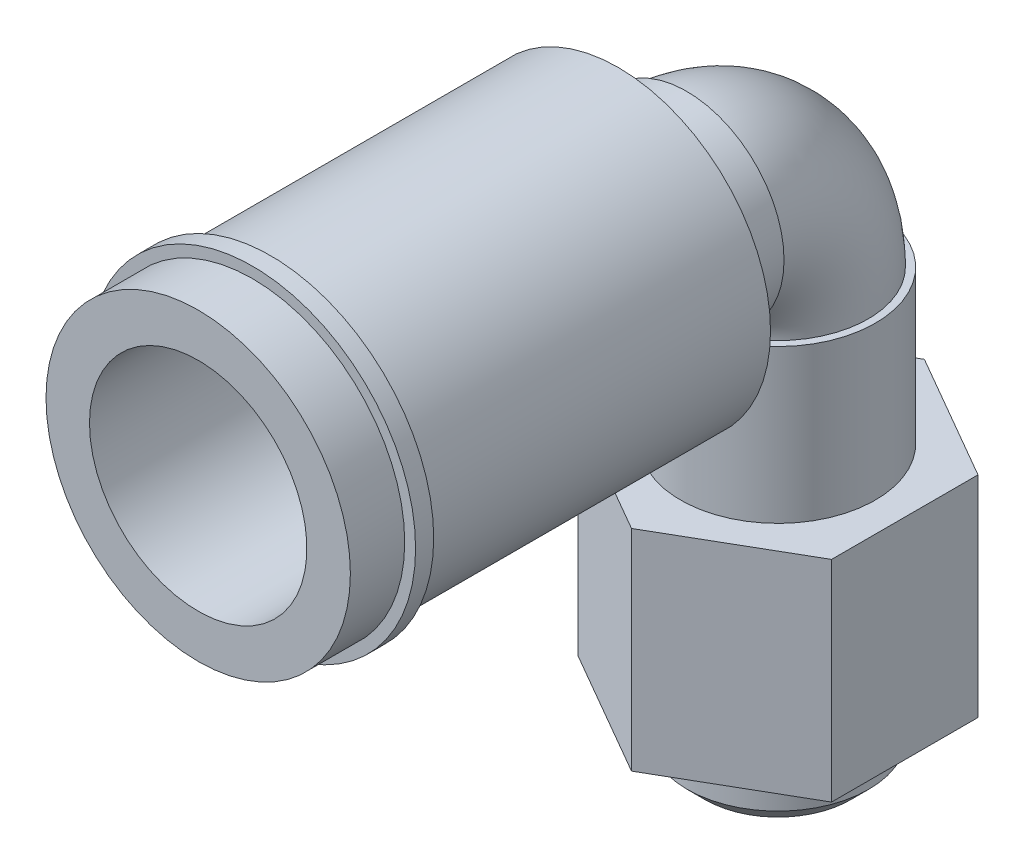
ISO-10303-21;
HEADER;
FILE_DESCRIPTION(('STEP AP214'),'2;1');
FILE_NAME('part.step','',(''),(''),'','','');
FILE_SCHEMA(('AUTOMOTIVE_DESIGN { 1 0 10303 214 1 1 1 1 }'));
ENDSEC;
DATA;
#1=APPLICATION_CONTEXT('core data for automotive mechanical design processes');
#2=APPLICATION_PROTOCOL_DEFINITION('international standard','automotive_design',2000,#1);
#3=PRODUCT_CONTEXT('',#1,'mechanical');
#4=PRODUCT('Part','Part','',(#3));
#5=PRODUCT_RELATED_PRODUCT_CATEGORY('part','',(#4));
#6=PRODUCT_DEFINITION_FORMATION('','',#4);
#7=PRODUCT_DEFINITION_CONTEXT('part definition',#1,'design');
#8=PRODUCT_DEFINITION('design','',#6,#7);
#9=PRODUCT_DEFINITION_SHAPE('','',#8);
#10=(LENGTH_UNIT() NAMED_UNIT(*) SI_UNIT(.MILLI.,.METRE.));
#11=(NAMED_UNIT(*) PLANE_ANGLE_UNIT() SI_UNIT($,.RADIAN.));
#12=(NAMED_UNIT(*) SI_UNIT($,.STERADIAN.) SOLID_ANGLE_UNIT());
#13=UNCERTAINTY_MEASURE_WITH_UNIT(LENGTH_MEASURE(1.E-05),#10,'distance_accuracy_value','');
#14=(GEOMETRIC_REPRESENTATION_CONTEXT(3) GLOBAL_UNCERTAINTY_ASSIGNED_CONTEXT((#13)) GLOBAL_UNIT_ASSIGNED_CONTEXT((#10,
#11,#12)) REPRESENTATION_CONTEXT('',''));
#15=CARTESIAN_POINT('',(0.,0.,0.));
#16=DIRECTION('',(0.,0.,1.));
#17=DIRECTION('',(1.,0.,0.));
#18=AXIS2_PLACEMENT_3D('',#15,#16,#17);
#19=CARTESIAN_POINT('',(-3.,11.4639957962037,5.));
#20=DIRECTION('',(0.,0.,1.));
#21=DIRECTION('',(1.,0.,0.));
#22=AXIS2_PLACEMENT_3D('',#19,#20,#21);
#23=PLANE('',#22);
#24=CARTESIAN_POINT('',(0.,14.5,5.));
#25=DIRECTION('',(0.,0.,-1.));
#26=DIRECTION('',(-1.,0.,0.));
#27=AXIS2_PLACEMENT_3D('',#24,#25,#26);
#28=CIRCLE('',#27,3.);
#29=CARTESIAN_POINT('',(-3.,14.5,5.));
#30=VERTEX_POINT('',#29);
#31=EDGE_CURVE('E19',#30,#30,#28,.T.);
#32=ORIENTED_EDGE('',*,*,#31,.F.);
#33=EDGE_LOOP('',(#32));
#34=FACE_BOUND('',#33,.T.);
#35=ADVANCED_FACE('F16',(#34),#23,.T.);
#36=CARTESIAN_POINT('',(0.,14.5,16.));
#37=DIRECTION('',(0.,0.,-1.));
#38=DIRECTION('',(-1.,0.,0.));
#39=AXIS2_PLACEMENT_3D('',#36,#37,#38);
#40=CYLINDRICAL_SURFACE('',#39,3.);
#41=ORIENTED_EDGE('',*,*,#31,.T.);
#42=EDGE_LOOP('',(#41));
#43=FACE_BOUND('',#42,.T.);
#44=CARTESIAN_POINT('',(0.,14.5,16.));
#45=DIRECTION('',(0.,0.,-1.));
#46=DIRECTION('',(-1.,0.,0.));
#47=AXIS2_PLACEMENT_3D('',#44,#45,#46);
#48=CIRCLE('',#47,3.);
#49=CARTESIAN_POINT('',(-3.,14.5,16.));
#50=VERTEX_POINT('',#49);
#51=EDGE_CURVE('E270',#50,#50,#48,.T.);
#52=ORIENTED_EDGE('',*,*,#51,.F.);
#53=EDGE_LOOP('',(#52));
#54=FACE_BOUND('',#53,.T.);
#55=ADVANCED_FACE('F257',(#43,#54),#40,.F.);
#56=CARTESIAN_POINT('',(4.2,18.7504021082164,16.));
#57=DIRECTION('',(0.,0.,1.));
#58=DIRECTION('',(-1.,0.,0.));
#59=AXIS2_PLACEMENT_3D('',#56,#57,#58);
#60=PLANE('',#59);
#61=ORIENTED_EDGE('',*,*,#51,.T.);
#62=EDGE_LOOP('',(#61));
#63=FACE_BOUND('',#62,.T.);
#64=CARTESIAN_POINT('',(0.,14.5,16.));
#65=DIRECTION('',(0.,0.,1.));
#66=DIRECTION('',(1.,0.,0.));
#67=AXIS2_PLACEMENT_3D('',#64,#65,#66);
#68=CIRCLE('',#67,4.2);
#69=CARTESIAN_POINT('',(4.2,14.5,16.));
#70=VERTEX_POINT('',#69);
#71=EDGE_CURVE('E271',#70,#70,#68,.F.);
#72=ORIENTED_EDGE('',*,*,#71,.F.);
#73=EDGE_LOOP('',(#72));
#74=FACE_BOUND('',#73,.T.);
#75=ADVANCED_FACE('F254',(#63,#74),#60,.T.);
#76=CARTESIAN_POINT('',(0.,14.5,16.));
#77=DIRECTION('',(0.,0.,1.));
#78=DIRECTION('',(1.,0.,0.));
#79=AXIS2_PLACEMENT_3D('',#76,#77,#78);
#80=CYLINDRICAL_SURFACE('',#79,4.2);
#81=ORIENTED_EDGE('',*,*,#71,.T.);
#82=EDGE_LOOP('',(#81));
#83=FACE_BOUND('',#82,.T.);
#84=CARTESIAN_POINT('',(0.,14.5,14.5));
#85=DIRECTION('',(0.,0.,1.));
#86=DIRECTION('',(1.,0.,0.));
#87=AXIS2_PLACEMENT_3D('',#84,#85,#86);
#88=CIRCLE('',#87,4.2);
#89=CARTESIAN_POINT('',(4.2,14.5,14.5));
#90=VERTEX_POINT('',#89);
#91=EDGE_CURVE('E273',#90,#90,#88,.F.);
#92=ORIENTED_EDGE('',*,*,#91,.F.);
#93=EDGE_LOOP('',(#92));
#94=FACE_BOUND('',#93,.T.);
#95=ADVANCED_FACE('F250',(#83,#94),#80,.T.);
#96=CARTESIAN_POINT('',(2.01,0.,2.03412212055392));
#97=DIRECTION('',(0.,-1.,0.));
#98=DIRECTION('',(-1.,0.,0.));
#99=AXIS2_PLACEMENT_3D('',#96,#97,#98);
#100=PLANE('',#99);
#101=CARTESIAN_POINT('',(0.,0.,0.));
#102=DIRECTION('',(0.,1.,0.));
#103=DIRECTION('',(0.,0.,1.));
#104=AXIS2_PLACEMENT_3D('',#101,#102,#103);
#105=CIRCLE('',#104,2.01);
#106=CARTESIAN_POINT('',(0.,0.,2.01));
#107=VERTEX_POINT('',#106);
#108=EDGE_CURVE('E278',#107,#107,#105,.T.);
#109=ORIENTED_EDGE('',*,*,#108,.F.);
#110=EDGE_LOOP('',(#109));
#111=FACE_BOUND('',#110,.T.);
#112=ADVANCED_FACE('F246',(#111),#100,.T.);
#113=CARTESIAN_POINT('',(4.5,19.0540021082242,14.5));
#114=DIRECTION('',(0.,0.,1.));
#115=DIRECTION('',(-1.,0.,0.));
#116=AXIS2_PLACEMENT_3D('',#113,#114,#115);
#117=PLANE('',#116);
#118=ORIENTED_EDGE('',*,*,#91,.T.);
#119=EDGE_LOOP('',(#118));
#120=FACE_BOUND('',#119,.T.);
#121=CARTESIAN_POINT('',(0.,14.5,14.5));
#122=DIRECTION('',(0.,0.,1.));
#123=DIRECTION('',(1.,0.,0.));
#124=AXIS2_PLACEMENT_3D('',#121,#122,#123);
#125=CIRCLE('',#124,4.5);
#126=CARTESIAN_POINT('',(4.5,14.5,14.5));
#127=VERTEX_POINT('',#126);
#128=EDGE_CURVE('E102',#127,#127,#125,.F.);
#129=ORIENTED_EDGE('',*,*,#128,.F.);
#130=EDGE_LOOP('',(#129));
#131=FACE_BOUND('',#130,.T.);
#132=ADVANCED_FACE('F242',(#120,#131),#117,.T.);
#133=CARTESIAN_POINT('',(0.,0.,0.));
#134=DIRECTION('',(0.,1.,0.));
#135=DIRECTION('',(0.,0.,1.));
#136=AXIS2_PLACEMENT_3D('',#133,#134,#135);
#137=CONICAL_SURFACE('',#136,2.01,0.785398163397449);
#138=CARTESIAN_POINT('',(0.,0.49,0.));
#139=DIRECTION('',(0.,-1.,0.));
#140=DIRECTION('',(-1.,0.,0.));
#141=AXIS2_PLACEMENT_3D('',#138,#139,#140);
#142=CIRCLE('',#141,2.5);
#143=CARTESIAN_POINT('',(-2.5,0.49,0.));
#144=VERTEX_POINT('',#143);
#145=EDGE_CURVE('E99',#144,#144,#142,.F.);
#146=ORIENTED_EDGE('',*,*,#145,.F.);
#147=EDGE_LOOP('',(#146));
#148=FACE_BOUND('',#147,.T.);
#149=ORIENTED_EDGE('',*,*,#108,.T.);
#150=EDGE_LOOP('',(#149));
#151=FACE_BOUND('',#150,.T.);
#152=ADVANCED_FACE('F238',(#148,#151),#137,.T.);
#153=CARTESIAN_POINT('',(0.,14.5,14.5));
#154=DIRECTION('',(0.,0.,1.));
#155=DIRECTION('',(1.,0.,0.));
#156=AXIS2_PLACEMENT_3D('',#153,#154,#155);
#157=CYLINDRICAL_SURFACE('',#156,4.5);
#158=ORIENTED_EDGE('',*,*,#128,.T.);
#159=EDGE_LOOP('',(#158));
#160=FACE_BOUND('',#159,.T.);
#161=CARTESIAN_POINT('',(0.,14.5,14.));
#162=DIRECTION('',(0.,0.,1.));
#163=DIRECTION('',(1.,0.,0.));
#164=AXIS2_PLACEMENT_3D('',#161,#162,#163);
#165=CIRCLE('',#164,4.5);
#166=CARTESIAN_POINT('',(4.5,14.5,14.));
#167=VERTEX_POINT('',#166);
#168=EDGE_CURVE('E101',#167,#167,#165,.F.);
#169=ORIENTED_EDGE('',*,*,#168,.F.);
#170=EDGE_LOOP('',(#169));
#171=FACE_BOUND('',#170,.T.);
#172=ADVANCED_FACE('F234',(#160,#171),#157,.T.);
#173=CARTESIAN_POINT('',(0.,0.49,0.));
#174=DIRECTION('',(0.,-1.,0.));
#175=DIRECTION('',(0.,0.,-1.));
#176=AXIS2_PLACEMENT_3D('',#173,#174,#175);
#177=CYLINDRICAL_SURFACE('',#176,2.5);
#178=CARTESIAN_POINT('',(0.,1.7,0.));
#179=DIRECTION('',(0.,-1.,0.));
#180=DIRECTION('',(0.,0.,-1.));
#181=AXIS2_PLACEMENT_3D('',#178,#179,#180);
#182=CIRCLE('',#181,2.5);
#183=CARTESIAN_POINT('',(0.,1.7,-2.5));
#184=VERTEX_POINT('',#183);
#185=EDGE_CURVE('E285',#184,#184,#182,.F.);
#186=ORIENTED_EDGE('',*,*,#185,.F.);
#187=EDGE_LOOP('',(#186));
#188=FACE_BOUND('',#187,.T.);
#189=ORIENTED_EDGE('',*,*,#145,.T.);
#190=EDGE_LOOP('',(#189));
#191=FACE_BOUND('',#190,.T.);
#192=ADVANCED_FACE('F230',(#188,#191),#177,.T.);
#193=CARTESIAN_POINT('',(-4.5,19.0540021082242,14.));
#194=DIRECTION('',(0.,0.,-1.));
#195=DIRECTION('',(1.,0.,0.));
#196=AXIS2_PLACEMENT_3D('',#193,#194,#195);
#197=PLANE('',#196);
#198=CARTESIAN_POINT('',(0.,14.5,14.));
#199=DIRECTION('',(0.,0.,1.));
#200=DIRECTION('',(0.,-1.,0.));
#201=AXIS2_PLACEMENT_3D('',#198,#199,#200);
#202=CIRCLE('',#201,4.20000000000001);
#203=CARTESIAN_POINT('',(0.,10.3,14.));
#204=VERTEX_POINT('',#203);
#205=EDGE_CURVE('E80',#204,#204,#202,.F.);
#206=ORIENTED_EDGE('',*,*,#205,.F.);
#207=EDGE_LOOP('',(#206));
#208=FACE_BOUND('',#207,.T.);
#209=ORIENTED_EDGE('',*,*,#168,.T.);
#210=EDGE_LOOP('',(#209));
#211=FACE_BOUND('',#210,.T.);
#212=ADVANCED_FACE('F226',(#208,#211),#197,.T.);
#213=CARTESIAN_POINT('',(-3.5,1.7,4.04145188432738));
#214=DIRECTION('',(0.,-1.,0.));
#215=DIRECTION('',(0.,0.,-1.));
#216=AXIS2_PLACEMENT_3D('',#213,#214,#215);
#217=PLANE('',#216);
#218=ORIENTED_EDGE('',*,*,#185,.T.);
#219=EDGE_LOOP('',(#218));
#220=FACE_BOUND('',#219,.T.);
#221=DIRECTION('',(0.866025403784439,0.,-0.5));
#222=VECTOR('',#221,1.);
#223=CARTESIAN_POINT('',(1.75,1.7,3.03108891324554));
#224=LINE('',#223,#222);
#225=CARTESIAN_POINT('',(6.25061246793852E-08,1.7,4.04145184823945));
#226=VERTEX_POINT('',#225);
#227=CARTESIAN_POINT('',(3.5,1.7,2.02072594216369));
#228=VERTEX_POINT('',#227);
#229=EDGE_CURVE('E185',#226,#228,#224,.T.);
#230=ORIENTED_EDGE('',*,*,#229,.F.);
#231=DIRECTION('',(0.866025403784439,0.,0.5));
#232=VECTOR('',#231,1.);
#233=CARTESIAN_POINT('',(-1.75,1.7,3.03108891324554));
#234=LINE('',#233,#232);
#235=CARTESIAN_POINT('',(-3.5,1.7,2.02072594216369));
#236=VERTEX_POINT('',#235);
#237=EDGE_CURVE('E84',#236,#226,#234,.T.);
#238=ORIENTED_EDGE('',*,*,#237,.F.);
#239=DIRECTION('',(0.,0.,1.));
#240=VECTOR('',#239,1.);
#241=CARTESIAN_POINT('',(-3.5,1.7,0.));
#242=LINE('',#241,#240);
#243=CARTESIAN_POINT('',(-3.5,1.7,-2.02072594216369));
#244=VERTEX_POINT('',#243);
#245=EDGE_CURVE('E66',#244,#236,#242,.T.);
#246=ORIENTED_EDGE('',*,*,#245,.F.);
#247=DIRECTION('',(-0.866025403784439,0.,0.5));
#248=VECTOR('',#247,1.);
#249=CARTESIAN_POINT('',(-1.75,1.7,-3.03108891324554));
#250=LINE('',#249,#248);
#251=CARTESIAN_POINT('',(-1.2501224919614E-07,1.7,-4.04145181215153));
#252=VERTEX_POINT('',#251);
#253=EDGE_CURVE('E71',#252,#244,#250,.T.);
#254=ORIENTED_EDGE('',*,*,#253,.F.);
#255=DIRECTION('',(-0.866025403784439,0.,-0.5));
#256=VECTOR('',#255,1.);
#257=CARTESIAN_POINT('',(1.75,1.7,-3.03108891324554));
#258=LINE('',#257,#256);
#259=CARTESIAN_POINT('',(3.5,1.7,-2.02072594216369));
#260=VERTEX_POINT('',#259);
#261=EDGE_CURVE('E177',#260,#252,#258,.T.);
#262=ORIENTED_EDGE('',*,*,#261,.F.);
#263=DIRECTION('',(0.,0.,-1.));
#264=VECTOR('',#263,1.);
#265=CARTESIAN_POINT('',(3.5,1.7,0.));
#266=LINE('',#265,#264);
#267=EDGE_CURVE('E180',#228,#260,#266,.T.);
#268=ORIENTED_EDGE('',*,*,#267,.F.);
#269=EDGE_LOOP('',(#230,#238,#246,#254,#262,#268));
#270=FACE_BOUND('',#269,.T.);
#271=ADVANCED_FACE('F83',(#220,#270),#217,.T.);
#272=CARTESIAN_POINT('',(0.,14.5,14.));
#273=DIRECTION('',(0.,0.,1.));
#274=DIRECTION('',(0.,-1.,0.));
#275=AXIS2_PLACEMENT_3D('',#272,#273,#274);
#276=CYLINDRICAL_SURFACE('',#275,4.20000000000001);
#277=ORIENTED_EDGE('',*,*,#205,.T.);
#278=EDGE_LOOP('',(#277));
#279=FACE_BOUND('',#278,.T.);
#280=CARTESIAN_POINT('',(0.,14.5,4.40513917895586));
#281=DIRECTION('',(0.,0.,-1.));
#282=DIRECTION('',(-1.,0.,0.));
#283=AXIS2_PLACEMENT_3D('',#280,#281,#282);
#284=CIRCLE('',#283,4.20000000000001);
#285=CARTESIAN_POINT('',(-4.20000000000001,14.5,4.40513917895586));
#286=VERTEX_POINT('',#285);
#287=EDGE_CURVE('E95',#286,#286,#284,.T.);
#288=ORIENTED_EDGE('',*,*,#287,.F.);
#289=EDGE_LOOP('',(#288));
#290=FACE_BOUND('',#289,.T.);
#291=ADVANCED_FACE('F220',(#279,#290),#276,.T.);
#292=CARTESIAN_POINT('',(0.,1.7,-4.04145188432738));
#293=DIRECTION('',(-0.5,0.,-0.866025403784438));
#294=DIRECTION('',(-0.866025403784438,0.,0.5));
#295=AXIS2_PLACEMENT_3D('',#292,#293,#294);
#296=PLANE('',#295);
#297=ORIENTED_EDGE('',*,*,#253,.T.);
#298=DIRECTION('',(0.,1.,0.));
#299=VECTOR('',#298,1.);
#300=CARTESIAN_POINT('',(-3.5,1.7,-2.02072594216369));
#301=LINE('',#300,#299);
#302=CARTESIAN_POINT('',(-3.5,7.5,-2.02072594216369));
#303=VERTEX_POINT('',#302);
#304=EDGE_CURVE('E73',#303,#244,#301,.F.);
#305=ORIENTED_EDGE('',*,*,#304,.F.);
#306=CARTESIAN_POINT('',(0.,7.5,-4.04145188432738));
#307=CARTESIAN_POINT('',(-0.145833333333333,7.5,-3.95725497007056));
#308=CARTESIAN_POINT('',(-0.291666666666667,7.5,-3.87305805581374));
#309=CARTESIAN_POINT('',(-0.583333333333333,7.5,-3.7046642273001));
#310=CARTESIAN_POINT('',(-0.729166666666667,7.5,-3.62046731304328));
#311=CARTESIAN_POINT('',(-1.02083333333333,7.5,-3.45207348452964));
#312=CARTESIAN_POINT('',(-1.16666666666667,7.5,-3.36787657027282));
#313=CARTESIAN_POINT('',(-1.45833333333333,7.5,-3.19948274175918));
#314=CARTESIAN_POINT('',(-1.60416666666667,7.5,-3.11528582750236));
#315=CARTESIAN_POINT('',(-1.89583333333333,7.5,-2.94689199898872));
#316=CARTESIAN_POINT('',(-2.04166666666667,7.5,-2.86269508473189));
#317=CARTESIAN_POINT('',(-2.33333333333333,7.5,-2.69430125621825));
#318=CARTESIAN_POINT('',(-2.47916666666667,7.5,-2.61010434196143));
#319=CARTESIAN_POINT('',(-2.77083333333333,7.5,-2.44171051344779));
#320=CARTESIAN_POINT('',(-2.91666666666667,7.5,-2.35751359919097));
#321=CARTESIAN_POINT('',(-3.20833333333333,7.5,-2.18911977067733));
#322=CARTESIAN_POINT('',(-3.35416666666667,7.5,-2.10492285642051));
#323=CARTESIAN_POINT('',(-3.5,7.5,-2.02072594216369));
#324=B_SPLINE_CURVE_WITH_KNOTS('',3,(#306,#307,#308,#309,#310,#311,#312,#313,#314,#315,#316,
#317,#318,#319,#320,#321,#322,#323),.UNSPECIFIED.,.F.,.F.,(4,2,2,2,2,2,2,2,4),(0.,
0.505181485540923,1.01036297108185,1.51554445662277,2.02072594216369,2.52590742770461,
3.03108891324554,3.53627039878646,4.04145188432738),.UNSPECIFIED.);
#325=CARTESIAN_POINT('',(-6.25061247335953E-08,7.5,-4.04145184823945));
#326=VERTEX_POINT('',#325);
#327=EDGE_CURVE('E98',#326,#303,#324,.T.);
#328=ORIENTED_EDGE('',*,*,#327,.F.);
#329=DIRECTION('',(0.,1.,0.));
#330=VECTOR('',#329,1.);
#331=CARTESIAN_POINT('',(0.,1.7,-4.04145188432738));
#332=LINE('',#331,#330);
#333=EDGE_CURVE('E76',#252,#326,#332,.T.);
#334=ORIENTED_EDGE('',*,*,#333,.F.);
#335=EDGE_LOOP('',(#297,#305,#328,#334));
#336=FACE_BOUND('',#335,.T.);
#337=ADVANCED_FACE('F72',(#336),#296,.T.);
#338=CARTESIAN_POINT('',(-3.5,1.7,-2.02072594216369));
#339=DIRECTION('',(-1.,0.,0.));
#340=DIRECTION('',(0.,0.,1.));
#341=AXIS2_PLACEMENT_3D('',#338,#339,#340);
#342=PLANE('',#341);
#343=ORIENTED_EDGE('',*,*,#245,.T.);
#344=DIRECTION('',(0.,1.,0.));
#345=VECTOR('',#344,1.);
#346=CARTESIAN_POINT('',(-3.5,1.7,2.02072594216369));
#347=LINE('',#346,#345);
#348=CARTESIAN_POINT('',(-3.5,7.5,2.02072594216369));
#349=VERTEX_POINT('',#348);
#350=EDGE_CURVE('E86',#349,#236,#347,.F.);
#351=ORIENTED_EDGE('',*,*,#350,.F.);
#352=DIRECTION('',(0.,0.,1.));
#353=VECTOR('',#352,1.);
#354=CARTESIAN_POINT('',(-3.5,7.5,0.));
#355=LINE('',#354,#353);
#356=EDGE_CURVE('E90',#303,#349,#355,.T.);
#357=ORIENTED_EDGE('',*,*,#356,.F.);
#358=ORIENTED_EDGE('',*,*,#304,.T.);
#359=EDGE_LOOP('',(#343,#351,#357,#358));
#360=FACE_BOUND('',#359,.T.);
#361=ADVANCED_FACE('F88',(#360),#342,.T.);
#362=CARTESIAN_POINT('',(-3.5,1.7,2.02072594216369));
#363=DIRECTION('',(-0.5,0.,0.866025403784438));
#364=DIRECTION('',(0.866025403784438,0.,0.5));
#365=AXIS2_PLACEMENT_3D('',#362,#363,#364);
#366=PLANE('',#365);
#367=ORIENTED_EDGE('',*,*,#237,.T.);
#368=DIRECTION('',(0.,1.,0.));
#369=VECTOR('',#368,1.);
#370=CARTESIAN_POINT('',(0.,1.7,4.04145188432738));
#371=LINE('',#370,#369);
#372=CARTESIAN_POINT('',(-6.25061246251751E-08,7.5,4.04145184823945));
#373=VERTEX_POINT('',#372);
#374=EDGE_CURVE('E187',#373,#226,#371,.F.);
#375=ORIENTED_EDGE('',*,*,#374,.F.);
#376=CARTESIAN_POINT('',(-3.5,7.5,2.02072594216369));
#377=CARTESIAN_POINT('',(-3.35416666666667,7.5,2.10492285642051));
#378=CARTESIAN_POINT('',(-3.20833333333333,7.5,2.18911977067733));
#379=CARTESIAN_POINT('',(-2.91666666666667,7.5,2.35751359919097));
#380=CARTESIAN_POINT('',(-2.77083333333333,7.5,2.44171051344779));
#381=CARTESIAN_POINT('',(-2.47916666666667,7.5,2.61010434196143));
#382=CARTESIAN_POINT('',(-2.33333333333333,7.5,2.69430125621825));
#383=CARTESIAN_POINT('',(-2.04166666666667,7.5,2.86269508473189));
#384=CARTESIAN_POINT('',(-1.89583333333333,7.5,2.94689199898872));
#385=CARTESIAN_POINT('',(-1.60416666666667,7.5,3.11528582750236));
#386=CARTESIAN_POINT('',(-1.45833333333333,7.5,3.19948274175918));
#387=CARTESIAN_POINT('',(-1.16666666666667,7.5,3.36787657027282));
#388=CARTESIAN_POINT('',(-1.02083333333333,7.5,3.45207348452964));
#389=CARTESIAN_POINT('',(-0.729166666666667,7.5,3.62046731304328));
#390=CARTESIAN_POINT('',(-0.583333333333333,7.5,3.7046642273001));
#391=CARTESIAN_POINT('',(-0.291666666666667,7.5,3.87305805581374));
#392=CARTESIAN_POINT('',(-0.145833333333333,7.5,3.95725497007056));
#393=CARTESIAN_POINT('',(0.,7.5,4.04145188432738));
#394=B_SPLINE_CURVE_WITH_KNOTS('',3,(#376,#377,#378,#379,#380,#381,#382,#383,#384,#385,#386,
#387,#388,#389,#390,#391,#392,#393),.UNSPECIFIED.,.F.,.F.,(4,2,2,2,2,2,2,2,4),(0.,
0.505181485540922,1.01036297108184,1.51554445662277,2.02072594216369,2.52590742770461,
3.03108891324554,3.53627039878646,4.04145188432738),.UNSPECIFIED.);
#395=EDGE_CURVE('E155',#349,#373,#394,.T.);
#396=ORIENTED_EDGE('',*,*,#395,.F.);
#397=ORIENTED_EDGE('',*,*,#350,.T.);
#398=EDGE_LOOP('',(#367,#375,#396,#397));
#399=FACE_BOUND('',#398,.T.);
#400=ADVANCED_FACE('F191',(#399),#366,.T.);
#401=CARTESIAN_POINT('',(0.,1.7,4.04145188432738));
#402=DIRECTION('',(0.5,0.,0.866025403784438));
#403=DIRECTION('',(0.866025403784438,0.,-0.5));
#404=AXIS2_PLACEMENT_3D('',#401,#402,#403);
#405=PLANE('',#404);
#406=ORIENTED_EDGE('',*,*,#229,.T.);
#407=DIRECTION('',(0.,1.,0.));
#408=VECTOR('',#407,1.);
#409=CARTESIAN_POINT('',(3.5,1.7,2.02072594216369));
#410=LINE('',#409,#408);
#411=CARTESIAN_POINT('',(3.5,7.5,2.02072594216369));
#412=VERTEX_POINT('',#411);
#413=EDGE_CURVE('E182',#412,#228,#410,.F.);
#414=ORIENTED_EDGE('',*,*,#413,.F.);
#415=CARTESIAN_POINT('',(0.,7.5,4.04145188432738));
#416=CARTESIAN_POINT('',(0.145833333333333,7.5,3.95725497007056));
#417=CARTESIAN_POINT('',(0.291666666666667,7.5,3.87305805581374));
#418=CARTESIAN_POINT('',(0.583333333333333,7.5,3.7046642273001));
#419=CARTESIAN_POINT('',(0.729166666666667,7.5,3.62046731304328));
#420=CARTESIAN_POINT('',(1.02083333333333,7.5,3.45207348452964));
#421=CARTESIAN_POINT('',(1.16666666666667,7.5,3.36787657027282));
#422=CARTESIAN_POINT('',(1.45833333333333,7.5,3.19948274175918));
#423=CARTESIAN_POINT('',(1.60416666666667,7.5,3.11528582750236));
#424=CARTESIAN_POINT('',(1.89583333333333,7.5,2.94689199898872));
#425=CARTESIAN_POINT('',(2.04166666666667,7.5,2.86269508473189));
#426=CARTESIAN_POINT('',(2.33333333333333,7.5,2.69430125621825));
#427=CARTESIAN_POINT('',(2.47916666666667,7.5,2.61010434196143));
#428=CARTESIAN_POINT('',(2.77083333333333,7.5,2.44171051344779));
#429=CARTESIAN_POINT('',(2.91666666666667,7.5,2.35751359919097));
#430=CARTESIAN_POINT('',(3.20833333333333,7.5,2.18911977067733));
#431=CARTESIAN_POINT('',(3.35416666666667,7.5,2.10492285642051));
#432=CARTESIAN_POINT('',(3.5,7.5,2.02072594216369));
#433=B_SPLINE_CURVE_WITH_KNOTS('',3,(#415,#416,#417,#418,#419,#420,#421,#422,#423,#424,#425,
#426,#427,#428,#429,#430,#431,#432),.UNSPECIFIED.,.F.,.F.,(4,2,2,2,2,2,2,2,4),(0.,
0.505181485540923,1.01036297108185,1.51554445662277,2.02072594216369,2.52590742770461,
3.03108891324554,3.53627039878646,4.04145188432738),.UNSPECIFIED.);
#434=EDGE_CURVE('E151',#373,#412,#433,.T.);
#435=ORIENTED_EDGE('',*,*,#434,.F.);
#436=ORIENTED_EDGE('',*,*,#374,.T.);
#437=EDGE_LOOP('',(#406,#414,#435,#436));
#438=FACE_BOUND('',#437,.T.);
#439=ADVANCED_FACE('F194',(#438),#405,.T.);
#440=CARTESIAN_POINT('',(3.5,1.7,2.02072594216369));
#441=DIRECTION('',(1.,0.,0.));
#442=DIRECTION('',(0.,0.,-1.));
#443=AXIS2_PLACEMENT_3D('',#440,#441,#442);
#444=PLANE('',#443);
#445=ORIENTED_EDGE('',*,*,#267,.T.);
#446=DIRECTION('',(0.,1.,0.));
#447=VECTOR('',#446,1.);
#448=CARTESIAN_POINT('',(3.5,1.7,-2.02072594216369));
#449=LINE('',#448,#447);
#450=CARTESIAN_POINT('',(3.5,7.5,-2.02072594216369));
#451=VERTEX_POINT('',#450);
#452=EDGE_CURVE('E34',#451,#260,#449,.F.);
#453=ORIENTED_EDGE('',*,*,#452,.F.);
#454=DIRECTION('',(0.,0.,-1.));
#455=VECTOR('',#454,1.);
#456=CARTESIAN_POINT('',(3.5,7.5,0.));
#457=LINE('',#456,#455);
#458=EDGE_CURVE('E154',#412,#451,#457,.T.);
#459=ORIENTED_EDGE('',*,*,#458,.F.);
#460=ORIENTED_EDGE('',*,*,#413,.T.);
#461=EDGE_LOOP('',(#445,#453,#459,#460));
#462=FACE_BOUND('',#461,.T.);
#463=ADVANCED_FACE('F197',(#462),#444,.T.);
#464=CARTESIAN_POINT('',(3.5,1.7,-2.02072594216369));
#465=DIRECTION('',(0.5,0.,-0.866025403784438));
#466=DIRECTION('',(-0.866025403784438,0.,-0.5));
#467=AXIS2_PLACEMENT_3D('',#464,#465,#466);
#468=PLANE('',#467);
#469=ORIENTED_EDGE('',*,*,#261,.T.);
#470=ORIENTED_EDGE('',*,*,#333,.T.);
#471=CARTESIAN_POINT('',(3.5,7.5,-2.02072594216369));
#472=CARTESIAN_POINT('',(3.35416666666667,7.5,-2.10492285642051));
#473=CARTESIAN_POINT('',(3.20833333333333,7.5,-2.18911977067733));
#474=CARTESIAN_POINT('',(2.91666666666667,7.5,-2.35751359919097));
#475=CARTESIAN_POINT('',(2.77083333333333,7.5,-2.44171051344779));
#476=CARTESIAN_POINT('',(2.47916666666667,7.5,-2.61010434196143));
#477=CARTESIAN_POINT('',(2.33333333333333,7.5,-2.69430125621825));
#478=CARTESIAN_POINT('',(2.04166666666667,7.5,-2.86269508473189));
#479=CARTESIAN_POINT('',(1.89583333333333,7.5,-2.94689199898872));
#480=CARTESIAN_POINT('',(1.60416666666667,7.5,-3.11528582750236));
#481=CARTESIAN_POINT('',(1.45833333333333,7.5,-3.19948274175918));
#482=CARTESIAN_POINT('',(1.16666666666667,7.5,-3.36787657027282));
#483=CARTESIAN_POINT('',(1.02083333333333,7.5,-3.45207348452964));
#484=CARTESIAN_POINT('',(0.729166666666667,7.5,-3.62046731304328));
#485=CARTESIAN_POINT('',(0.583333333333333,7.5,-3.7046642273001));
#486=CARTESIAN_POINT('',(0.291666666666667,7.5,-3.87305805581374));
#487=CARTESIAN_POINT('',(0.145833333333333,7.5,-3.95725497007056));
#488=CARTESIAN_POINT('',(0.,7.5,-4.04145188432738));
#489=B_SPLINE_CURVE_WITH_KNOTS('',3,(#471,#472,#473,#474,#475,#476,#477,#478,#479,#480,#481,
#482,#483,#484,#485,#486,#487,#488),.UNSPECIFIED.,.F.,.F.,(4,2,2,2,2,2,2,2,4),(0.,
0.505181485540922,1.01036297108184,1.51554445662277,2.02072594216369,2.52590742770461,
3.03108891324554,3.53627039878646,4.04145188432738),.UNSPECIFIED.);
#490=EDGE_CURVE('E147',#451,#326,#489,.T.);
#491=ORIENTED_EDGE('',*,*,#490,.F.);
#492=ORIENTED_EDGE('',*,*,#452,.T.);
#493=EDGE_LOOP('',(#469,#470,#491,#492));
#494=FACE_BOUND('',#493,.T.);
#495=ADVANCED_FACE('F200',(#494),#468,.T.);
#496=CARTESIAN_POINT('',(0.,14.5,4.));
#497=DIRECTION('',(0.,0.,1.));
#498=DIRECTION('',(1.,0.,0.));
#499=AXIS2_PLACEMENT_3D('',#496,#497,#498);
#500=CONICAL_SURFACE('',#499,2.688,1.30899693899575);
#501=ORIENTED_EDGE('',*,*,#287,.T.);
#502=EDGE_LOOP('',(#501));
#503=FACE_BOUND('',#502,.T.);
#504=CARTESIAN_POINT('',(0.,14.5,4.));
#505=DIRECTION('',(0.,0.,1.));
#506=DIRECTION('',(-1.,0.,0.));
#507=AXIS2_PLACEMENT_3D('',#504,#505,#506);
#508=CIRCLE('',#507,2.688);
#509=CARTESIAN_POINT('',(-2.688,14.5,4.));
#510=VERTEX_POINT('',#509);
#511=EDGE_CURVE('E172',#510,#510,#508,.F.);
#512=ORIENTED_EDGE('',*,*,#511,.F.);
#513=EDGE_LOOP('',(#512));
#514=FACE_BOUND('',#513,.T.);
#515=ADVANCED_FACE('F202',(#503,#514),#500,.T.);
#516=CARTESIAN_POINT('',(-3.5,7.5,-4.04145188432738));
#517=DIRECTION('',(0.,1.,0.));
#518=DIRECTION('',(0.,0.,1.));
#519=AXIS2_PLACEMENT_3D('',#516,#517,#518);
#520=PLANE('',#519);
#521=CARTESIAN_POINT('',(0.,7.5,0.));
#522=DIRECTION('',(0.,-1.,0.));
#523=DIRECTION('',(0.,0.,-1.));
#524=AXIS2_PLACEMENT_3D('',#521,#522,#523);
#525=CIRCLE('',#524,2.688);
#526=CARTESIAN_POINT('',(0.,7.5,-2.688));
#527=VERTEX_POINT('',#526);
#528=EDGE_CURVE('E175',#527,#527,#525,.F.);
#529=ORIENTED_EDGE('',*,*,#528,.F.);
#530=EDGE_LOOP('',(#529));
#531=FACE_BOUND('',#530,.T.);
#532=ORIENTED_EDGE('',*,*,#458,.T.);
#533=ORIENTED_EDGE('',*,*,#490,.T.);
#534=ORIENTED_EDGE('',*,*,#327,.T.);
#535=ORIENTED_EDGE('',*,*,#356,.T.);
#536=ORIENTED_EDGE('',*,*,#395,.T.);
#537=ORIENTED_EDGE('',*,*,#434,.T.);
#538=EDGE_LOOP('',(#532,#533,#534,#535,#536,#537));
#539=FACE_BOUND('',#538,.T.);
#540=ADVANCED_FACE('F141',(#531,#539),#520,.T.);
#541=CARTESIAN_POINT('',(0.,14.5,4.));
#542=DIRECTION('',(0.,0.,1.));
#543=DIRECTION('',(1.,0.,0.));
#544=AXIS2_PLACEMENT_3D('',#541,#542,#543);
#545=CYLINDRICAL_SURFACE('',#544,2.688);
#546=ORIENTED_EDGE('',*,*,#511,.T.);
#547=EDGE_LOOP('',(#546));
#548=FACE_BOUND('',#547,.T.);
#549=CARTESIAN_POINT('',(0.,14.5,2.52));
#550=DIRECTION('',(0.,0.,1.));
#551=DIRECTION('',(1.,0.,0.));
#552=AXIS2_PLACEMENT_3D('',#549,#550,#551);
#553=CIRCLE('',#552,2.688);
#554=CARTESIAN_POINT('',(2.688,14.5,2.52));
#555=VERTEX_POINT('',#554);
#556=EDGE_CURVE('E292',#555,#555,#553,.F.);
#557=ORIENTED_EDGE('',*,*,#556,.F.);
#558=EDGE_LOOP('',(#557));
#559=FACE_BOUND('',#558,.T.);
#560=ADVANCED_FACE('F139',(#548,#559),#545,.T.);
#561=CARTESIAN_POINT('',(0.,7.5,0.));
#562=DIRECTION('',(0.,-1.,0.));
#563=DIRECTION('',(0.,0.,-1.));
#564=AXIS2_PLACEMENT_3D('',#561,#562,#563);
#565=CYLINDRICAL_SURFACE('',#564,2.688);
#566=ORIENTED_EDGE('',*,*,#528,.T.);
#567=EDGE_LOOP('',(#566));
#568=FACE_BOUND('',#567,.T.);
#569=CARTESIAN_POINT('',(0.,11.728,0.));
#570=DIRECTION('',(0.,-1.,0.));
#571=DIRECTION('',(0.,0.,-1.));
#572=AXIS2_PLACEMENT_3D('',#569,#570,#571);
#573=CIRCLE('',#572,2.688);
#574=CARTESIAN_POINT('',(0.,11.728,-2.688));
#575=VERTEX_POINT('',#574);
#576=EDGE_CURVE('E294',#575,#575,#573,.F.);
#577=ORIENTED_EDGE('',*,*,#576,.F.);
#578=EDGE_LOOP('',(#577));
#579=FACE_BOUND('',#578,.T.);
#580=ADVANCED_FACE('F305',(#568,#579),#565,.T.);
#581=CARTESIAN_POINT('',(-2.688,17.2202581206185,2.52));
#582=DIRECTION('',(0.,0.,-1.));
#583=DIRECTION('',(1.,0.,0.));
#584=AXIS2_PLACEMENT_3D('',#581,#582,#583);
#585=PLANE('',#584);
#586=CARTESIAN_POINT('',(0.,17.06142666585,2.52));
#587=CARTESIAN_POINT('',(0.0697494697385218,17.0614263313262,2.52));
#588=CARTESIAN_POINT('',(0.139507080312608,17.0584853892175,2.52));
#589=CARTESIAN_POINT('',(0.278538432340526,17.0467414190916,2.52));
#590=CARTESIAN_POINT('',(0.347812053909613,17.0379369873101,2.52));
#591=CARTESIAN_POINT('',(0.485474846308647,17.0145083699566,2.52));
#592=CARTESIAN_POINT('',(0.55386262591394,16.999875961562,2.52));
#593=CARTESIAN_POINT('',(0.689201481951012,16.9648927354729,2.52));
#594=CARTESIAN_POINT('',(0.756151325399139,16.944537205798,2.52));
#595=CARTESIAN_POINT('',(0.953847416537437,16.8751658903672,2.52));
#596=CARTESIAN_POINT('',(1.08176390187636,16.817789928206,2.52));
#597=CARTESIAN_POINT('',(1.3261415120178,16.6823582433297,2.52));
#598=CARTESIAN_POINT('',(1.44260215674975,16.6043016544743,2.52));
#599=CARTESIAN_POINT('',(1.60621463822098,16.4734658557826,2.52));
#600=CARTESIAN_POINT('',(1.65895004002391,16.4275124452965,2.52));
#601=CARTESIAN_POINT('',(1.76033108972607,16.3313679356382,2.52));
#602=CARTESIAN_POINT('',(1.8089806324348,16.2811809657054,2.52));
#603=CARTESIAN_POINT('',(1.90190779176235,16.1768708587465,2.52));
#604=CARTESIAN_POINT('',(1.94618348629219,16.122746009201,2.52));
#605=CARTESIAN_POINT('',(2.03003487997384,16.0109722410136,2.52));
#606=CARTESIAN_POINT('',(2.0696094812323,15.9533225039124,2.52));
#607=CARTESIAN_POINT('',(2.18095491043182,15.7755024727493,2.52));
#608=CARTESIAN_POINT('',(2.24527605932107,15.6505415410717,2.52));
#609=CARTESIAN_POINT('',(2.35207167328668,15.3916885697631,2.52));
#610=CARTESIAN_POINT('',(2.39454566431388,15.2577963364081,2.52));
#611=CARTESIAN_POINT('',(2.45669331275734,14.9842864120937,2.52));
#612=CARTESIAN_POINT('',(2.47628258773793,14.8446494847713,2.52));
#613=CARTESIAN_POINT('',(2.49191512994946,14.5640850117584,2.52));
#614=CARTESIAN_POINT('',(2.48795969586442,14.4231575376803,2.52));
#615=CARTESIAN_POINT('',(2.45665775971441,14.1428715952107,2.52));
#616=CARTESIAN_POINT('',(2.42913809123677,14.0035324999568,2.52));
#617=CARTESIAN_POINT('',(2.35146673330465,13.7312972768392,2.52));
#618=CARTESIAN_POINT('',(2.30130970729256,13.5984026763942,2.52));
#619=CARTESIAN_POINT('',(2.17903581419829,13.3403913011829,2.52));
#620=CARTESIAN_POINT('',(2.10656227290478,13.215443853984,2.52));
#621=CARTESIAN_POINT('',(1.94249570976865,12.9789545128122,2.52));
#622=CARTESIAN_POINT('',(1.85091211252147,12.8674060533671,2.52));
#623=CARTESIAN_POINT('',(1.64743068165042,12.6554192827581,2.52));
#624=CARTESIAN_POINT('',(1.53483516696667,12.5556542247148,2.52));
#625=CARTESIAN_POINT('',(1.29593237455675,12.3740082428695,2.52));
#626=CARTESIAN_POINT('',(1.16961161685856,12.2921451431616,2.52));
#627=CARTESIAN_POINT('',(0.984909199818851,12.1893447302611,2.52));
#628=CARTESIAN_POINT('',(0.930502476813896,12.1609959261725,2.52));
#629=CARTESIAN_POINT('',(0.820242249154688,12.1072049958341,2.52));
#630=CARTESIAN_POINT('',(0.764388445210294,12.0817634768618,2.52));
#631=CARTESIAN_POINT('',(0.65133405334284,12.0338633545246,2.52));
#632=CARTESIAN_POINT('',(0.594131771480124,12.0114087673029,2.52));
#633=CARTESIAN_POINT('',(0.478491086372374,11.9699427795522,2.52));
#634=CARTESIAN_POINT('',(0.420053285882038,11.9509297414414,2.52));
#635=CARTESIAN_POINT('',(0.331399388271658,11.9261092332729,2.52));
#636=CARTESIAN_POINT('',(0.301701870662049,11.9184560824304,2.52));
#637=CARTESIAN_POINT('',(0.241943031319436,11.9047567151831,2.52));
#638=CARTESIAN_POINT('',(0.211881868533163,11.8987098214686,2.52));
#639=CARTESIAN_POINT('',(0.151625605904601,11.8887405901378,2.52));
#640=CARTESIAN_POINT('',(0.121433128794245,11.8848029131646,2.52));
#641=CARTESIAN_POINT('',(0.0608271138471186,11.8794797308685,2.52));
#642=CARTESIAN_POINT('',(0.0304136842670295,11.8780930505361,2.52));
#643=CARTESIAN_POINT('',(-0.0310149513492492,11.8780935631097,2.52));
#644=CARTESIAN_POINT('',(-0.0620301675551099,11.879536136412,2.52));
#645=CARTESIAN_POINT('',(-0.12382703490977,11.8850656742436,2.52));
#646=CARTESIAN_POINT('',(-0.154608564349495,11.8891539323301,2.52));
#647=CARTESIAN_POINT('',(-0.216047185057225,11.8994901227429,2.52));
#648=CARTESIAN_POINT('',(-0.246701319398269,11.9057550416127,2.52));
#649=CARTESIAN_POINT('',(-0.307630756711677,11.9199253573576,2.52));
#650=CARTESIAN_POINT('',(-0.337905923915631,11.927831325271,2.52));
#651=CARTESIAN_POINT('',(-0.404285913396548,11.9466663800789,2.52));
#652=CARTESIAN_POINT('',(-0.440308550809541,11.957882790014,2.52));
#653=CARTESIAN_POINT('',(-0.511858987517098,11.9817655850376,2.52));
#654=CARTESIAN_POINT('',(-0.547386839583689,11.9944318141444,2.52));
#655=CARTESIAN_POINT('',(-0.653320957679132,12.0343078858249,2.52));
#656=CARTESIAN_POINT('',(-0.723031931899493,12.0633814348809,2.52));
#657=CARTESIAN_POINT('',(-0.860380924785035,12.1259309106347,2.52));
#658=CARTESIAN_POINT('',(-0.928020344447911,12.1594037772018,2.52));
#659=CARTESIAN_POINT('',(-1.06089468663832,12.2307772444608,2.52));
#660=CARTESIAN_POINT('',(-1.12613051869195,12.2686761472111,2.52));
#661=CARTESIAN_POINT('',(-1.26576475145971,12.3565320595305,2.52));
#662=CARTESIAN_POINT('',(-1.33958370518994,12.4074170184082,2.52));
#663=CARTESIAN_POINT('',(-1.48238806734402,12.5155712296787,2.52));
#664=CARTESIAN_POINT('',(-1.5513739855399,12.5728398070933,2.52));
#665=CARTESIAN_POINT('',(-1.68357862695504,12.6935004774587,2.52));
#666=CARTESIAN_POINT('',(-1.74680636848324,12.7568826632403,2.52));
#667=CARTESIAN_POINT('',(-1.86681040909986,12.8894812023064,2.52));
#668=CARTESIAN_POINT('',(-1.92358778629442,12.9586965772603,2.52));
#669=CARTESIAN_POINT('',(-2.02527159696531,13.0960968984351,2.52));
#670=CARTESIAN_POINT('',(-2.07078335142234,13.1638343541973,2.52));
#671=CARTESIAN_POINT('',(-2.15536456354821,13.303257398206,2.52));
#672=CARTESIAN_POINT('',(-2.1944316728151,13.3749444130177,2.52));
#673=CARTESIAN_POINT('',(-2.26567657085987,13.5216878031955,2.52));
#674=CARTESIAN_POINT('',(-2.29785318647943,13.5967447496905,2.52));
#675=CARTESIAN_POINT('',(-2.35495706586879,13.7495753034261,2.52));
#676=CARTESIAN_POINT('',(-2.37988182408273,13.8273498392374,2.52));
#677=CARTESIAN_POINT('',(-2.43912380473578,14.0481308653312,2.52));
#678=CARTESIAN_POINT('',(-2.46498431797748,14.1935106261016,2.52));
#679=CARTESIAN_POINT('',(-2.49107467251085,14.4864100128093,2.52));
#680=CARTESIAN_POINT('',(-2.49132065906666,14.6339282321857,2.52));
#681=CARTESIAN_POINT('',(-2.46648473783731,14.9223293331875,2.52));
#682=CARTESIAN_POINT('',(-2.4421649563113,15.063278287315,2.52));
#683=CARTESIAN_POINT('',(-2.3698862906159,15.3390751515288,2.52));
#684=CARTESIAN_POINT('',(-2.32192640497304,15.4739228028792,2.52));
#685=CARTESIAN_POINT('',(-2.23370508561017,15.6677297698151,2.52));
#686=CARTESIAN_POINT('',(-2.20179267561353,15.730614627107,2.52));
#687=CARTESIAN_POINT('',(-2.13276355631449,15.8534615651194,2.52));
#688=CARTESIAN_POINT('',(-2.09564811530156,15.9134243533365,2.52));
#689=CARTESIAN_POINT('',(-2.01648938967173,16.0299599164733,2.52));
#690=CARTESIAN_POINT('',(-1.97444855579724,16.0865343563441,2.52));
#691=CARTESIAN_POINT('',(-1.8856961206211,16.1959627068794,2.52));
#692=CARTESIAN_POINT('',(-1.83898000550388,16.2488129364286,2.52));
#693=CARTESIAN_POINT('',(-1.69290597390993,16.4005347108252,2.52));
#694=CARTESIAN_POINT('',(-1.58710408386324,16.493338208433,2.52));
#695=CARTESIAN_POINT('',(-1.36137434872281,16.6597778350665,2.52));
#696=CARTESIAN_POINT('',(-1.24144729625042,16.7334150388487,2.52));
#697=CARTESIAN_POINT('',(-1.05374434544907,16.8278681258292,2.52));
#698=CARTESIAN_POINT('',(-0.989882275297675,16.8566830207928,2.52));
#699=CARTESIAN_POINT('',(-0.859991286264503,16.9088049857241,2.52));
#700=CARTESIAN_POINT('',(-0.793964205048183,16.9321165957717,2.52));
#701=CARTESIAN_POINT('',(-0.660278715686039,16.9730525533461,2.52));
#702=CARTESIAN_POINT('',(-0.592622763651313,16.9906849498339,2.52));
#703=CARTESIAN_POINT('',(-0.456076433432882,17.0201819206403,2.52));
#704=CARTESIAN_POINT('',(-0.387186355897147,17.0320478804422,2.52));
#705=CARTESIAN_POINT('',(-0.265227552750256,17.0477930927339,2.52));
#706=CARTESIAN_POINT('',(-0.212314297689732,17.0529036030659,2.52));
#707=CARTESIAN_POINT('',(-0.106268936694856,17.0597205173602,2.52));
#708=CARTESIAN_POINT('',(-0.0531368307203834,17.0614269206984,2.52));
#709=CARTESIAN_POINT('',(0.,17.06142666585,2.52));
#710=B_SPLINE_CURVE_WITH_KNOTS('',3,(#586,#587,#588,#589,#590,#591,#592,#593,#594,#595,#596,
#597,#598,#599,#600,#601,#602,#603,#604,#605,#606,#607,#608,#609,#610,#611,#612,#613,#614,#615,
#616,#617,#618,#619,#620,#621,#622,#623,#624,#625,#626,#627,#628,#629,#630,#631,#632,#633,#634,
#635,#636,#637,#638,#639,#640,#641,#642,#643,#644,#645,#646,#647,#648,#649,#650,#651,#652,#653,
#654,#655,#656,#657,#658,#659,#660,#661,#662,#663,#664,#665,#666,#667,#668,#669,#670,#671,#672,
#673,#674,#675,#676,#677,#678,#679,#680,#681,#682,#683,#684,#685,#686,#687,#688,#689,#690,#691,
#692,#693,#694,#695,#696,#697,#698,#699,#700,#701,#702,#703,#704,#705,#706,#707,#708,#709),
.UNSPECIFIED.,.T.,.F.,(4,2,2,2,2,2,2,2,2,2,2,2,2,2,2,2,2,2,2,2,2,2,2,2,2,2,2,2,2,2,2,2,2,2,2,2,
2,2,2,2,2,2,2,2,2,2,2,2,2,2,2,2,2,2,2,2,2,2,2,2,2,4),(0.,0.209200130037268,0.41845036220214,
0.62799688202949,0.837716434206787,1.25618292570879,1.67466694608067,1.8843032445685,
2.09373738566916,2.30326315702865,2.51283776523556,2.93230484283847,3.35178102183712,
3.77279909470998,4.19379394519445,4.61790937405544,5.04212483665774,5.4735069918199,
5.90467690094267,6.35416289114235,6.80409439502865,6.98808595607591,7.17211587953799,
7.3563907957665,7.54057779720921,7.63254965550808,7.7244826702894,7.81573769489706,
7.90695067618174,7.99996690374977,8.09302864422853,8.18683358103376,8.28067121417219,
8.39381588157623,8.50694838750449,8.73335661361014,8.95960817730546,9.18577322843288,
9.45440301114486,9.72300441691494,9.99117763901873,10.2593059728251,10.5037870363683,
10.7483569919408,10.9929685543381,11.2376645312602,11.6782683895033,12.1185945260908,
12.5456672024682,12.9727579726201,13.1841074045643,13.3954054073205,13.6065987168828,
13.8179979299066,14.2380700279931,14.6581185653155,14.8680954804795,15.0778985595293,
15.2874029697016,15.4968570180001,15.6562307006984,15.8156044126154),.UNSPECIFIED.);
#711=CARTESIAN_POINT('',(0.,17.06142666585,2.52));
#712=VERTEX_POINT('',#711);
#713=EDGE_CURVE('E25',#712,#712,#710,.T.);
#714=ORIENTED_EDGE('',*,*,#713,.F.);
#715=EDGE_LOOP('',(#714));
#716=FACE_BOUND('',#715,.T.);
#717=ORIENTED_EDGE('',*,*,#556,.T.);
#718=EDGE_LOOP('',(#717));
#719=FACE_BOUND('',#718,.T.);
#720=ADVANCED_FACE('F302',(#716,#719),#585,.T.);
#721=CARTESIAN_POINT('',(-2.688,11.728,2.72025812062504));
#722=DIRECTION('',(0.,1.,0.));
#723=DIRECTION('',(1.,0.,0.));
#724=AXIS2_PLACEMENT_3D('',#721,#722,#723);
#725=PLANE('',#724);
#726=CARTESIAN_POINT('',(-2.48799999999987,11.728,-7.99257407653464E-07));
#727=CARTESIAN_POINT('',(-2.48799491566558,11.728,0.135631673538537));
#728=CARTESIAN_POINT('',(-2.47687493764537,11.728,0.271343942081261));
#729=CARTESIAN_POINT('',(-2.43265898407272,11.728,0.539243951274506));
#730=CARTESIAN_POINT('',(-2.3995393153623,11.728,0.671427732000502));
#731=CARTESIAN_POINT('',(-2.3108731268037,11.728,0.932506969265175));
#732=CARTESIAN_POINT('',(-2.2546840168861,11.728,1.0611850344371));
#733=CARTESIAN_POINT('',(-2.12151026940237,11.728,1.30725317832653));
#734=CARTESIAN_POINT('',(-2.04452895084042,11.728,1.42464505457608));
#735=CARTESIAN_POINT('',(-1.87195483324077,11.728,1.64483874063948));
#736=CARTESIAN_POINT('',(-1.77636254800032,11.728,1.74764095309812));
#737=CARTESIAN_POINT('',(-1.5692518909412,11.728,1.93575965312572));
#738=CARTESIAN_POINT('',(-1.45773010306967,11.728,2.02107238052543));
#739=CARTESIAN_POINT('',(-1.22191324197474,11.728,2.17178911868632));
#740=CARTESIAN_POINT('',(-1.09761342007887,11.728,2.23718569201553));
#741=CARTESIAN_POINT('',(-0.839874487021439,11.728,2.34612279232303));
#742=CARTESIAN_POINT('',(-0.706444267221135,11.728,2.38968424799371));
#743=CARTESIAN_POINT('',(-0.476991956879009,11.728,2.44373667999046));
#744=CARTESIAN_POINT('',(-0.382357673202384,11.728,2.46031411205497));
#745=CARTESIAN_POINT('',(-0.191829637627634,11.728,2.48244674926556));
#746=CARTESIAN_POINT('',(-0.0959361427146157,11.728,2.48800416928313));
#747=CARTESIAN_POINT('',(0.12448135357056,11.728,2.48799459017224));
#748=CARTESIAN_POINT('',(0.249034509836511,11.728,2.47862557688822));
#749=CARTESIAN_POINT('',(0.43365703244933,11.728,2.45070963525712));
#750=CARTESIAN_POINT('',(0.494858467569062,11.728,2.43908512306247));
#751=CARTESIAN_POINT('',(0.616264692895743,11.728,2.41127376282186));
#752=CARTESIAN_POINT('',(0.676468743723742,11.728,2.39508367756227));
#753=CARTESIAN_POINT('',(0.85489146304886,11.728,2.33982475043434));
#754=CARTESIAN_POINT('',(0.971099474823899,11.728,2.29404007072877));
#755=CARTESIAN_POINT('',(1.19536239134545,11.728,2.18558256777141));
#756=CARTESIAN_POINT('',(1.30341601906751,11.728,2.12290710632027));
#757=CARTESIAN_POINT('',(1.46385199325821,11.728,2.01300428306596));
#758=CARTESIAN_POINT('',(1.51989434590509,11.728,1.97102907311997));
#759=CARTESIAN_POINT('',(1.62820182738581,11.728,1.88254932646617));
#760=CARTESIAN_POINT('',(1.68046985083859,11.728,1.83604832635692));
#761=CARTESIAN_POINT('',(1.83116227976158,11.728,1.69012052252006));
#762=CARTESIAN_POINT('',(1.92349605031465,11.728,1.58425449620392));
#763=CARTESIAN_POINT('',(2.08901462183999,11.728,1.35859006290886));
#764=CARTESIAN_POINT('',(2.16220189492431,11.728,1.23879345747347));
#765=CARTESIAN_POINT('',(2.2874345682299,11.728,0.988606674370886));
#766=CARTESIAN_POINT('',(2.33948129878338,11.728,0.858217163913926));
#767=CARTESIAN_POINT('',(2.42094364668606,11.728,0.590551395516332));
#768=CARTESIAN_POINT('',(2.45035866547039,11.728,0.453274955532049));
#769=CARTESIAN_POINT('',(2.485725725204,11.728,0.175729724986275));
#770=CARTESIAN_POINT('',(2.49167753041402,11.728,0.0354609043740169));
#771=CARTESIAN_POINT('',(2.47994720387418,11.728,-0.24408377322688));
#772=CARTESIAN_POINT('',(2.46226523784164,11.728,-0.383359637171134));
#773=CARTESIAN_POINT('',(2.40376982691589,11.728,-0.656966633067769));
#774=CARTESIAN_POINT('',(2.36295629003676,11.728,-0.791297745354391));
#775=CARTESIAN_POINT('',(2.25935499624346,11.728,-1.0512044589172));
#776=CARTESIAN_POINT('',(2.19656670434525,11.728,-1.17677984694258));
#777=CARTESIAN_POINT('',(2.05080199138305,11.728,-1.41560036487926));
#778=CARTESIAN_POINT('',(1.96782663379286,11.728,-1.52884614387132));
#779=CARTESIAN_POINT('',(1.78405513933816,11.728,-1.73978646938422));
#780=CARTESIAN_POINT('',(1.68326134026952,11.728,-1.83748305278234));
#781=CARTESIAN_POINT('',(1.46666560346871,11.728,-2.01459901391604));
#782=CARTESIAN_POINT('',(1.35085894935789,11.728,-2.09401262609053));
#783=CARTESIAN_POINT('',(1.10750151795377,11.728,-2.23230680642557));
#784=CARTESIAN_POINT('',(0.979943869434373,11.728,-2.2911752635334));
#785=CARTESIAN_POINT('',(0.716880274932659,11.728,-2.38657675435581));
#786=CARTESIAN_POINT('',(0.58138646288125,11.728,-2.42314295784971));
#787=CARTESIAN_POINT('',(0.370699543246827,11.728,-2.46135731080386));
#788=CARTESIAN_POINT('',(0.296925046636486,11.728,-2.47133783605706));
#789=CARTESIAN_POINT('',(0.148779019776557,11.728,-2.48466094170539));
#790=CARTESIAN_POINT('',(0.0744074889813548,11.728,-2.48800351603358));
#791=CARTESIAN_POINT('',(-0.139717052735956,11.728,-2.48799339784402));
#792=CARTESIAN_POINT('',(-0.279560889139432,11.728,-2.47618893674926));
#793=CARTESIAN_POINT('',(-0.555425079061287,11.728,-2.42925442248936));
#794=CARTESIAN_POINT('',(-0.691439408236438,11.728,-2.39408954765872));
#795=CARTESIAN_POINT('',(-0.95556893540315,11.728,-2.30143380278335));
#796=CARTESIAN_POINT('',(-1.08368860217585,11.728,-2.24395570021325));
#797=CARTESIAN_POINT('',(-1.32840978643188,11.728,-2.10832615687424));
#798=CARTESIAN_POINT('',(-1.44501531095167,11.728,-2.03018194318953));
#799=CARTESIAN_POINT('',(-1.66346013308792,11.728,-1.8554269426616));
#800=CARTESIAN_POINT('',(-1.76529888852025,11.728,-1.75881547806729));
#801=CARTESIAN_POINT('',(-1.95133950393855,11.728,-1.54983606897871));
#802=CARTESIAN_POINT('',(-2.03553648938871,11.728,-1.43746378394744));
#803=CARTESIAN_POINT('',(-2.1838962132021,11.728,-1.20014188753067));
#804=CARTESIAN_POINT('',(-2.24805077213127,11.728,-1.07518716861507));
#805=CARTESIAN_POINT('',(-2.35440432149603,11.728,-0.816368587287194));
#806=CARTESIAN_POINT('',(-2.39662717979056,11.728,-0.6825145895657));
#807=CARTESIAN_POINT('',(-2.44747029023056,11.728,-0.456597032267437));
#808=CARTESIAN_POINT('',(-2.46264949300971,11.728,-0.36595507245757));
#809=CARTESIAN_POINT('',(-2.48291571832766,11.728,-0.183554473021395));
#810=CARTESIAN_POINT('',(-2.48800344104188,11.728,-0.0917959113125779));
#811=CARTESIAN_POINT('',(-2.48799999999987,11.728,-7.99257407653464E-07));
#812=B_SPLINE_CURVE_WITH_KNOTS('',3,(#726,#727,#728,#729,#730,#731,#732,#733,#734,#735,#736,
#737,#738,#739,#740,#741,#742,#743,#744,#745,#746,#747,#748,#749,#750,#751,#752,#753,#754,#755,
#756,#757,#758,#759,#760,#761,#762,#763,#764,#765,#766,#767,#768,#769,#770,#771,#772,#773,#774,
#775,#776,#777,#778,#779,#780,#781,#782,#783,#784,#785,#786,#787,#788,#789,#790,#791,#792,#793,
#794,#795,#796,#797,#798,#799,#800,#801,#802,#803,#804,#805,#806,#807,#808,#809,#810,#811),
.UNSPECIFIED.,.T.,.F.,(4,2,2,2,2,2,2,2,2,2,2,2,2,2,2,2,2,2,2,2,2,2,2,2,2,2,2,2,2,2,2,2,2,2,2,2,
2,2,2,2,2,2,4),(0.,0.406582030490988,0.813602651919347,1.23282577236191,1.65198201285767,
2.0711266832505,2.49036137378051,2.90975243068844,3.32874073404645,3.61636322283425,
3.90392789757897,4.27705567756264,4.46379654205362,4.65067014928128,5.02388042499615,
5.39714902686428,5.60697794689837,5.81664419658877,6.23590122829251,6.65510410061459,
7.07428058924694,7.49346816390321,7.91265995020425,8.33184879719551,8.75103931116162,
9.17024003119529,9.58941867211693,10.0085423571777,10.4277980330001,10.8473004377962,
11.2661773922899,11.4892535342475,11.7123298800918,12.1312066625657,12.5507092393798,
12.9699721326837,13.3890886002458,13.8082204524043,14.2274679611462,14.6468863444664,
15.0658473212117,15.3410382992434,15.616210183079),.UNSPECIFIED.);
#813=CARTESIAN_POINT('',(-2.48799999999987,11.728,-7.99257407653464E-07));
#814=VERTEX_POINT('',#813);
#815=EDGE_CURVE('E11',#814,#814,#812,.T.);
#816=ORIENTED_EDGE('',*,*,#815,.F.);
#817=EDGE_LOOP('',(#816));
#818=FACE_BOUND('',#817,.T.);
#819=ORIENTED_EDGE('',*,*,#576,.T.);
#820=EDGE_LOOP('',(#819));
#821=FACE_BOUND('',#820,.T.);
#822=ADVANCED_FACE('F114',(#818,#821),#725,.T.);
#823=CARTESIAN_POINT('',(0.,11.728,2.856));
#824=DIRECTION('',(-1.,0.,0.));
#825=DIRECTION('',(0.,0.,1.));
#826=AXIS2_PLACEMENT_3D('',#823,#824,#825);
#827=TOROIDAL_SURFACE('',#826,2.856,2.488);
#828=ORIENTED_EDGE('',*,*,#713,.T.);
#829=EDGE_LOOP('',(#828));
#830=FACE_BOUND('',#829,.T.);
#831=ORIENTED_EDGE('',*,*,#815,.T.);
#832=EDGE_LOOP('',(#831));
#833=FACE_BOUND('',#832,.T.);
#834=ADVANCED_FACE('F116',(#830,#833),#827,.T.);
#835=CLOSED_SHELL('',(#35,#55,#75,#95,#112,#132,#152,#172,#192,#212,#271,#291,#337,#361,#400,
#439,#463,#495,#515,#540,#560,#580,#720,#822,#834));
#836=MANIFOLD_SOLID_BREP('B1',#835);
#837=ADVANCED_BREP_SHAPE_REPRESENTATION('',(#18,#836),#14);
#838=SHAPE_DEFINITION_REPRESENTATION(#9,#837);
ENDSEC;
END-ISO-10303-21;
